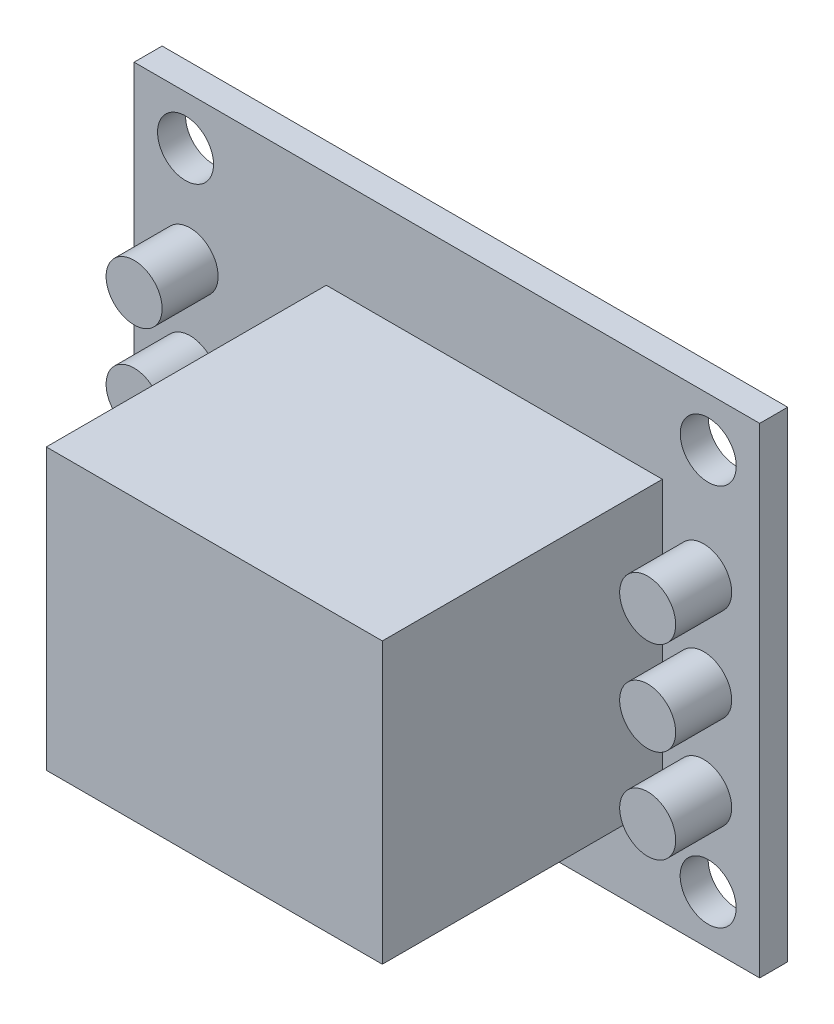
ISO-10303-21;
HEADER;
FILE_DESCRIPTION(('STEP AP214'),'2;1');
FILE_NAME('part.step','',(''),(''),'','','');
FILE_SCHEMA(('AUTOMOTIVE_DESIGN { 1 0 10303 214 1 1 1 1 }'));
ENDSEC;
DATA;
#1=APPLICATION_CONTEXT('core data for automotive mechanical design processes');
#2=APPLICATION_PROTOCOL_DEFINITION('international standard','automotive_design',2000,#1);
#3=PRODUCT_CONTEXT('',#1,'mechanical');
#4=PRODUCT('Part','Part','',(#3));
#5=PRODUCT_RELATED_PRODUCT_CATEGORY('part','',(#4));
#6=PRODUCT_DEFINITION_FORMATION('','',#4);
#7=PRODUCT_DEFINITION_CONTEXT('part definition',#1,'design');
#8=PRODUCT_DEFINITION('design','',#6,#7);
#9=PRODUCT_DEFINITION_SHAPE('','',#8);
#10=(LENGTH_UNIT() NAMED_UNIT(*) SI_UNIT(.MILLI.,.METRE.));
#11=(NAMED_UNIT(*) PLANE_ANGLE_UNIT() SI_UNIT($,.RADIAN.));
#12=(NAMED_UNIT(*) SI_UNIT($,.STERADIAN.) SOLID_ANGLE_UNIT());
#13=UNCERTAINTY_MEASURE_WITH_UNIT(LENGTH_MEASURE(1.E-05),#10,'distance_accuracy_value','');
#14=(GEOMETRIC_REPRESENTATION_CONTEXT(3) GLOBAL_UNCERTAINTY_ASSIGNED_CONTEXT((#13)) GLOBAL_UNIT_ASSIGNED_CONTEXT((#10,
#11,#12)) REPRESENTATION_CONTEXT('',''));
#15=CARTESIAN_POINT('',(0.,0.,0.));
#16=DIRECTION('',(0.,0.,1.));
#17=DIRECTION('',(1.,0.,0.));
#18=AXIS2_PLACEMENT_3D('',#15,#16,#17);
#19=CARTESIAN_POINT('',(0.,0.,1.5));
#20=DIRECTION('',(0.,0.,1.));
#21=DIRECTION('',(1.,0.,0.));
#22=AXIS2_PLACEMENT_3D('',#19,#20,#21);
#23=PLANE('',#22);
#24=CARTESIAN_POINT('',(16.28013764939,-5.89932861440915,1.5));
#25=DIRECTION('',(0.,0.,1.));
#26=DIRECTION('',(1.,0.,0.));
#27=AXIS2_PLACEMENT_3D('',#24,#25,#26);
#28=CIRCLE('',#27,1.5);
#29=CARTESIAN_POINT('',(17.78013764939,-5.89932861440915,1.5));
#30=VERTEX_POINT('',#29);
#31=EDGE_CURVE('E291',#30,#30,#28,.T.);
#32=ORIENTED_EDGE('',*,*,#31,.F.);
#33=EDGE_LOOP('',(#32));
#34=FACE_BOUND('',#33,.T.);
#35=CARTESIAN_POINT('',(16.28013764939,-0.899328614409152,1.5));
#36=DIRECTION('',(0.,0.,1.));
#37=DIRECTION('',(1.,0.,0.));
#38=AXIS2_PLACEMENT_3D('',#35,#36,#37);
#39=CIRCLE('',#38,1.5);
#40=CARTESIAN_POINT('',(17.78013764939,-0.899328614409152,1.5));
#41=VERTEX_POINT('',#40);
#42=EDGE_CURVE('E290',#41,#41,#39,.T.);
#43=ORIENTED_EDGE('',*,*,#42,.F.);
#44=EDGE_LOOP('',(#43));
#45=FACE_BOUND('',#44,.T.);
#46=CARTESIAN_POINT('',(16.28013764939,4.10067138559085,1.5));
#47=DIRECTION('',(0.,0.,1.));
#48=DIRECTION('',(1.,0.,0.));
#49=AXIS2_PLACEMENT_3D('',#46,#47,#48);
#50=CIRCLE('',#49,1.5);
#51=CARTESIAN_POINT('',(17.78013764939,4.10067138559085,1.5));
#52=VERTEX_POINT('',#51);
#53=EDGE_CURVE('E300',#52,#52,#50,.T.);
#54=ORIENTED_EDGE('',*,*,#53,.F.);
#55=EDGE_LOOP('',(#54));
#56=FACE_BOUND('',#55,.T.);
#57=CARTESIAN_POINT('',(-11.22986235061,-5.,1.5));
#58=DIRECTION('',(0.,0.,1.));
#59=DIRECTION('',(1.,0.,0.));
#60=AXIS2_PLACEMENT_3D('',#57,#58,#59);
#61=CIRCLE('',#60,1.5);
#62=CARTESIAN_POINT('',(-9.72986235061004,-5.,1.5));
#63=VERTEX_POINT('',#62);
#64=EDGE_CURVE('E305',#63,#63,#61,.T.);
#65=ORIENTED_EDGE('',*,*,#64,.F.);
#66=EDGE_LOOP('',(#65));
#67=FACE_BOUND('',#66,.T.);
#68=CARTESIAN_POINT('',(-11.22986235061,0.,1.5));
#69=DIRECTION('',(0.,0.,1.));
#70=DIRECTION('',(1.,0.,0.));
#71=AXIS2_PLACEMENT_3D('',#68,#69,#70);
#72=CIRCLE('',#71,1.5);
#73=CARTESIAN_POINT('',(-9.72986235061004,0.,1.5));
#74=VERTEX_POINT('',#73);
#75=EDGE_CURVE('E311',#74,#74,#72,.T.);
#76=ORIENTED_EDGE('',*,*,#75,.F.);
#77=EDGE_LOOP('',(#76));
#78=FACE_BOUND('',#77,.T.);
#79=CARTESIAN_POINT('',(-11.22986235061,5.,1.5));
#80=DIRECTION('',(0.,0.,1.));
#81=DIRECTION('',(1.,0.,0.));
#82=AXIS2_PLACEMENT_3D('',#79,#80,#81);
#83=CIRCLE('',#82,1.5);
#84=CARTESIAN_POINT('',(-9.72986235061004,5.,1.5));
#85=VERTEX_POINT('',#84);
#86=EDGE_CURVE('E317',#85,#85,#83,.T.);
#87=ORIENTED_EDGE('',*,*,#86,.F.);
#88=EDGE_LOOP('',(#87));
#89=FACE_BOUND('',#88,.T.);
#90=CARTESIAN_POINT('',(16.52013764939,-10.4262328767123,1.5));
#91=DIRECTION('',(0.,0.,1.));
#92=DIRECTION('',(1.,0.,0.));
#93=AXIS2_PLACEMENT_3D('',#90,#91,#92);
#94=CIRCLE('',#93,1.5);
#95=CARTESIAN_POINT('',(18.02013764939,-10.4262328767123,1.5));
#96=VERTEX_POINT('',#95);
#97=EDGE_CURVE('E144',#96,#96,#94,.T.);
#98=ORIENTED_EDGE('',*,*,#97,.F.);
#99=EDGE_LOOP('',(#98));
#100=FACE_BOUND('',#99,.T.);
#101=CARTESIAN_POINT('',(-11.47486235061,10.0737665135316,1.5));
#102=DIRECTION('',(0.,0.,1.));
#103=DIRECTION('',(1.,0.,0.));
#104=AXIS2_PLACEMENT_3D('',#101,#102,#103);
#105=CIRCLE('',#104,1.5);
#106=CARTESIAN_POINT('',(-9.97486235061004,10.0737665135316,1.5));
#107=VERTEX_POINT('',#106);
#108=EDGE_CURVE('E156',#107,#107,#105,.T.);
#109=ORIENTED_EDGE('',*,*,#108,.F.);
#110=EDGE_LOOP('',(#109));
#111=FACE_BOUND('',#110,.T.);
#112=DIRECTION('',(0.,-1.,0.));
#113=VECTOR('',#112,1.);
#114=CARTESIAN_POINT('',(-14.22986235061,12.6887671232877,1.5));
#115=LINE('',#114,#113);
#116=CARTESIAN_POINT('',(-14.22986235061,12.6887671232877,1.5));
#117=VERTEX_POINT('',#116);
#118=CARTESIAN_POINT('',(-14.22986235061,-13.0412328767123,1.5));
#119=VERTEX_POINT('',#118);
#120=EDGE_CURVE('E162',#117,#119,#115,.T.);
#121=ORIENTED_EDGE('',*,*,#120,.T.);
#122=DIRECTION('',(1.,0.,0.));
#123=VECTOR('',#122,1.);
#124=CARTESIAN_POINT('',(-14.22986235061,-13.0412328767123,1.5));
#125=LINE('',#124,#123);
#126=CARTESIAN_POINT('',(19.28013764939,-13.0412328767123,1.5));
#127=VERTEX_POINT('',#126);
#128=EDGE_CURVE('E86',#119,#127,#125,.T.);
#129=ORIENTED_EDGE('',*,*,#128,.T.);
#130=DIRECTION('',(0.,1.,0.));
#131=VECTOR('',#130,1.);
#132=CARTESIAN_POINT('',(19.28013764939,12.6887671232877,1.5));
#133=LINE('',#132,#131);
#134=CARTESIAN_POINT('',(19.28013764939,12.6887671232877,1.5));
#135=VERTEX_POINT('',#134);
#136=EDGE_CURVE('E165',#127,#135,#133,.T.);
#137=ORIENTED_EDGE('',*,*,#136,.T.);
#138=DIRECTION('',(-1.,0.,0.));
#139=VECTOR('',#138,1.);
#140=CARTESIAN_POINT('',(-14.22986235061,12.6887671232877,1.5));
#141=LINE('',#140,#139);
#142=EDGE_CURVE('E58',#135,#117,#141,.T.);
#143=ORIENTED_EDGE('',*,*,#142,.T.);
#144=EDGE_LOOP('',(#121,#129,#137,#143));
#145=FACE_BOUND('',#144,.T.);
#146=CARTESIAN_POINT('',(-11.47986235061,-10.4262328767123,1.5));
#147=DIRECTION('',(0.,0.,1.));
#148=DIRECTION('',(1.,0.,0.));
#149=AXIS2_PLACEMENT_3D('',#146,#147,#148);
#150=CIRCLE('',#149,1.5);
#151=CARTESIAN_POINT('',(-9.97986235061004,-10.4262328767123,1.5));
#152=VERTEX_POINT('',#151);
#153=EDGE_CURVE('E150',#152,#152,#150,.T.);
#154=ORIENTED_EDGE('',*,*,#153,.F.);
#155=EDGE_LOOP('',(#154));
#156=FACE_BOUND('',#155,.T.);
#157=CARTESIAN_POINT('',(16.52513764939,10.0737665135316,1.5));
#158=DIRECTION('',(0.,0.,1.));
#159=DIRECTION('',(1.,0.,0.));
#160=AXIS2_PLACEMENT_3D('',#157,#158,#159);
#161=CIRCLE('',#160,1.5);
#162=CARTESIAN_POINT('',(18.02513764939,10.0737665135316,1.5));
#163=VERTEX_POINT('',#162);
#164=EDGE_CURVE('E136',#163,#163,#161,.T.);
#165=ORIENTED_EDGE('',*,*,#164,.F.);
#166=EDGE_LOOP('',(#165));
#167=FACE_BOUND('',#166,.T.);
#168=DIRECTION('',(1.,0.,0.));
#169=VECTOR('',#168,1.);
#170=CARTESIAN_POINT('',(-3.93328594625488,-7.51123287671233,1.5));
#171=LINE('',#170,#169);
#172=CARTESIAN_POINT('',(-3.93328594625488,-7.51123287671233,1.5));
#173=VERTEX_POINT('',#172);
#174=CARTESIAN_POINT('',(14.0667140537451,-7.51123287671233,1.5));
#175=VERTEX_POINT('',#174);
#176=EDGE_CURVE('E329',#173,#175,#171,.T.);
#177=ORIENTED_EDGE('',*,*,#176,.F.);
#178=DIRECTION('',(0.,-1.,0.));
#179=VECTOR('',#178,1.);
#180=CARTESIAN_POINT('',(-3.93328594625489,7.48876712328767,1.5));
#181=LINE('',#180,#179);
#182=CARTESIAN_POINT('',(-3.93328594625489,7.48876712328767,1.5));
#183=VERTEX_POINT('',#182);
#184=EDGE_CURVE('E131',#183,#173,#181,.T.);
#185=ORIENTED_EDGE('',*,*,#184,.F.);
#186=DIRECTION('',(-1.,0.,0.));
#187=VECTOR('',#186,1.);
#188=CARTESIAN_POINT('',(-3.93328594625489,7.48876712328767,1.5));
#189=LINE('',#188,#187);
#190=CARTESIAN_POINT('',(14.0667140537451,7.48876712328767,1.5));
#191=VERTEX_POINT('',#190);
#192=EDGE_CURVE('E127',#191,#183,#189,.T.);
#193=ORIENTED_EDGE('',*,*,#192,.F.);
#194=DIRECTION('',(0.,1.,0.));
#195=VECTOR('',#194,1.);
#196=CARTESIAN_POINT('',(14.0667140537451,7.48876712328767,1.5));
#197=LINE('',#196,#195);
#198=EDGE_CURVE('E331',#175,#191,#197,.T.);
#199=ORIENTED_EDGE('',*,*,#198,.F.);
#200=EDGE_LOOP('',(#177,#185,#193,#199));
#201=FACE_BOUND('',#200,.T.);
#202=ADVANCED_FACE('F34',(#34,#45,#56,#67,#78,#89,#100,#111,#145,#156,#167,#201),#23,.T.);
#203=CARTESIAN_POINT('',(0.,0.,0.));
#204=DIRECTION('',(0.,0.,1.));
#205=DIRECTION('',(1.,0.,0.));
#206=AXIS2_PLACEMENT_3D('',#203,#204,#205);
#207=PLANE('',#206);
#208=DIRECTION('',(0.,-1.,0.));
#209=VECTOR('',#208,1.);
#210=CARTESIAN_POINT('',(-14.22986235061,12.6887671232877,0.));
#211=LINE('',#210,#209);
#212=CARTESIAN_POINT('',(-14.22986235061,12.6887671232877,0.));
#213=VERTEX_POINT('',#212);
#214=CARTESIAN_POINT('',(-14.22986235061,-13.0412328767123,0.));
#215=VERTEX_POINT('',#214);
#216=EDGE_CURVE('E159',#213,#215,#211,.T.);
#217=ORIENTED_EDGE('',*,*,#216,.F.);
#218=DIRECTION('',(-1.,0.,0.));
#219=VECTOR('',#218,1.);
#220=CARTESIAN_POINT('',(-14.22986235061,12.6887671232877,0.));
#221=LINE('',#220,#219);
#222=CARTESIAN_POINT('',(19.28013764939,12.6887671232877,0.));
#223=VERTEX_POINT('',#222);
#224=EDGE_CURVE('E79',#223,#213,#221,.T.);
#225=ORIENTED_EDGE('',*,*,#224,.F.);
#226=DIRECTION('',(0.,1.,0.));
#227=VECTOR('',#226,1.);
#228=CARTESIAN_POINT('',(19.28013764939,12.6887671232877,0.));
#229=LINE('',#228,#227);
#230=CARTESIAN_POINT('',(19.28013764939,-13.0412328767123,0.));
#231=VERTEX_POINT('',#230);
#232=EDGE_CURVE('E173',#231,#223,#229,.T.);
#233=ORIENTED_EDGE('',*,*,#232,.F.);
#234=DIRECTION('',(1.,0.,0.));
#235=VECTOR('',#234,1.);
#236=CARTESIAN_POINT('',(-14.22986235061,-13.0412328767123,0.));
#237=LINE('',#236,#235);
#238=EDGE_CURVE('E171',#215,#231,#237,.T.);
#239=ORIENTED_EDGE('',*,*,#238,.F.);
#240=EDGE_LOOP('',(#217,#225,#233,#239));
#241=FACE_BOUND('',#240,.T.);
#242=CARTESIAN_POINT('',(-11.47486235061,10.0737665135316,0.));
#243=DIRECTION('',(0.,0.,1.));
#244=DIRECTION('',(1.,0.,0.));
#245=AXIS2_PLACEMENT_3D('',#242,#243,#244);
#246=CIRCLE('',#245,1.5);
#247=CARTESIAN_POINT('',(-9.97486235061004,10.0737665135316,0.));
#248=VERTEX_POINT('',#247);
#249=EDGE_CURVE('E153',#248,#248,#246,.T.);
#250=ORIENTED_EDGE('',*,*,#249,.T.);
#251=EDGE_LOOP('',(#250));
#252=FACE_BOUND('',#251,.T.);
#253=CARTESIAN_POINT('',(-11.47986235061,-10.4262328767123,0.));
#254=DIRECTION('',(0.,0.,1.));
#255=DIRECTION('',(1.,0.,0.));
#256=AXIS2_PLACEMENT_3D('',#253,#254,#255);
#257=CIRCLE('',#256,1.5);
#258=CARTESIAN_POINT('',(-9.97986235061004,-10.4262328767123,0.));
#259=VERTEX_POINT('',#258);
#260=EDGE_CURVE('E147',#259,#259,#257,.T.);
#261=ORIENTED_EDGE('',*,*,#260,.T.);
#262=EDGE_LOOP('',(#261));
#263=FACE_BOUND('',#262,.T.);
#264=CARTESIAN_POINT('',(16.52013764939,-10.4262328767123,0.));
#265=DIRECTION('',(0.,0.,1.));
#266=DIRECTION('',(1.,0.,0.));
#267=AXIS2_PLACEMENT_3D('',#264,#265,#266);
#268=CIRCLE('',#267,1.5);
#269=CARTESIAN_POINT('',(18.02013764939,-10.4262328767123,0.));
#270=VERTEX_POINT('',#269);
#271=EDGE_CURVE('E142',#270,#270,#268,.T.);
#272=ORIENTED_EDGE('',*,*,#271,.T.);
#273=EDGE_LOOP('',(#272));
#274=FACE_BOUND('',#273,.T.);
#275=CARTESIAN_POINT('',(16.52513764939,10.0737665135316,0.));
#276=DIRECTION('',(0.,0.,1.));
#277=DIRECTION('',(1.,0.,0.));
#278=AXIS2_PLACEMENT_3D('',#275,#276,#277);
#279=CIRCLE('',#278,1.5);
#280=CARTESIAN_POINT('',(18.02513764939,10.0737665135316,0.));
#281=VERTEX_POINT('',#280);
#282=EDGE_CURVE('E133',#281,#281,#279,.T.);
#283=ORIENTED_EDGE('',*,*,#282,.T.);
#284=EDGE_LOOP('',(#283));
#285=FACE_BOUND('',#284,.T.);
#286=ADVANCED_FACE('F186',(#241,#252,#263,#274,#285),#207,.F.);
#287=CARTESIAN_POINT('',(-14.22986235061,12.6887671232877,1.5));
#288=DIRECTION('',(1.,0.,0.));
#289=DIRECTION('',(0.,1.,0.));
#290=AXIS2_PLACEMENT_3D('',#287,#288,#289);
#291=PLANE('',#290);
#292=ORIENTED_EDGE('',*,*,#216,.T.);
#293=DIRECTION('',(0.,0.,-1.));
#294=VECTOR('',#293,1.);
#295=CARTESIAN_POINT('',(-14.22986235061,-13.0412328767123,1.5));
#296=LINE('',#295,#294);
#297=EDGE_CURVE('E11',#119,#215,#296,.T.);
#298=ORIENTED_EDGE('',*,*,#297,.F.);
#299=ORIENTED_EDGE('',*,*,#120,.F.);
#300=DIRECTION('',(0.,0.,-1.));
#301=VECTOR('',#300,1.);
#302=CARTESIAN_POINT('',(-14.22986235061,12.6887671232877,1.5));
#303=LINE('',#302,#301);
#304=EDGE_CURVE('E168',#117,#213,#303,.T.);
#305=ORIENTED_EDGE('',*,*,#304,.T.);
#306=EDGE_LOOP('',(#292,#298,#299,#305));
#307=FACE_BOUND('',#306,.T.);
#308=ADVANCED_FACE('F36',(#307),#291,.F.);
#309=CARTESIAN_POINT('',(-14.22986235061,-13.0412328767123,1.5));
#310=DIRECTION('',(0.,1.,0.));
#311=DIRECTION('',(0.,0.,1.));
#312=AXIS2_PLACEMENT_3D('',#309,#310,#311);
#313=PLANE('',#312);
#314=ORIENTED_EDGE('',*,*,#238,.T.);
#315=DIRECTION('',(0.,0.,-1.));
#316=VECTOR('',#315,1.);
#317=CARTESIAN_POINT('',(19.28013764939,-13.0412328767123,1.5));
#318=LINE('',#317,#316);
#319=EDGE_CURVE('E42',#127,#231,#318,.T.);
#320=ORIENTED_EDGE('',*,*,#319,.F.);
#321=ORIENTED_EDGE('',*,*,#128,.F.);
#322=ORIENTED_EDGE('',*,*,#297,.T.);
#323=EDGE_LOOP('',(#314,#320,#321,#322));
#324=FACE_BOUND('',#323,.T.);
#325=ADVANCED_FACE('F202',(#324),#313,.F.);
#326=CARTESIAN_POINT('',(19.28013764939,12.6887671232877,1.5));
#327=DIRECTION('',(-1.,0.,0.));
#328=DIRECTION('',(0.,-1.,0.));
#329=AXIS2_PLACEMENT_3D('',#326,#327,#328);
#330=PLANE('',#329);
#331=ORIENTED_EDGE('',*,*,#232,.T.);
#332=DIRECTION('',(0.,0.,-1.));
#333=VECTOR('',#332,1.);
#334=CARTESIAN_POINT('',(19.28013764939,12.6887671232877,1.5));
#335=LINE('',#334,#333);
#336=EDGE_CURVE('E177',#135,#223,#335,.T.);
#337=ORIENTED_EDGE('',*,*,#336,.F.);
#338=ORIENTED_EDGE('',*,*,#136,.F.);
#339=ORIENTED_EDGE('',*,*,#319,.T.);
#340=EDGE_LOOP('',(#331,#337,#338,#339));
#341=FACE_BOUND('',#340,.T.);
#342=ADVANCED_FACE('F182',(#341),#330,.F.);
#343=CARTESIAN_POINT('',(-14.22986235061,12.6887671232877,1.5));
#344=DIRECTION('',(0.,-1.,0.));
#345=DIRECTION('',(0.,0.,-1.));
#346=AXIS2_PLACEMENT_3D('',#343,#344,#345);
#347=PLANE('',#346);
#348=ORIENTED_EDGE('',*,*,#224,.T.);
#349=ORIENTED_EDGE('',*,*,#304,.F.);
#350=ORIENTED_EDGE('',*,*,#142,.F.);
#351=ORIENTED_EDGE('',*,*,#336,.T.);
#352=EDGE_LOOP('',(#348,#349,#350,#351));
#353=FACE_BOUND('',#352,.T.);
#354=ADVANCED_FACE('F191',(#353),#347,.F.);
#355=CARTESIAN_POINT('',(-11.47486235061,10.0737665135316,1.5));
#356=DIRECTION('',(0.,0.,-1.));
#357=DIRECTION('',(-1.,0.,0.));
#358=AXIS2_PLACEMENT_3D('',#355,#356,#357);
#359=CYLINDRICAL_SURFACE('',#358,1.5);
#360=ORIENTED_EDGE('',*,*,#108,.T.);
#361=EDGE_LOOP('',(#360));
#362=FACE_BOUND('',#361,.T.);
#363=ORIENTED_EDGE('',*,*,#249,.F.);
#364=EDGE_LOOP('',(#363));
#365=FACE_BOUND('',#364,.T.);
#366=ADVANCED_FACE('F193',(#362,#365),#359,.F.);
#367=CARTESIAN_POINT('',(-11.47986235061,-10.4262328767123,1.5));
#368=DIRECTION('',(0.,0.,-1.));
#369=DIRECTION('',(-1.,0.,0.));
#370=AXIS2_PLACEMENT_3D('',#367,#368,#369);
#371=CYLINDRICAL_SURFACE('',#370,1.5);
#372=ORIENTED_EDGE('',*,*,#153,.T.);
#373=EDGE_LOOP('',(#372));
#374=FACE_BOUND('',#373,.T.);
#375=ORIENTED_EDGE('',*,*,#260,.F.);
#376=EDGE_LOOP('',(#375));
#377=FACE_BOUND('',#376,.T.);
#378=ADVANCED_FACE('F199',(#374,#377),#371,.F.);
#379=CARTESIAN_POINT('',(16.52013764939,-10.4262328767123,1.5));
#380=DIRECTION('',(0.,0.,-1.));
#381=DIRECTION('',(-1.,0.,0.));
#382=AXIS2_PLACEMENT_3D('',#379,#380,#381);
#383=CYLINDRICAL_SURFACE('',#382,1.5);
#384=ORIENTED_EDGE('',*,*,#97,.T.);
#385=EDGE_LOOP('',(#384));
#386=FACE_BOUND('',#385,.T.);
#387=ORIENTED_EDGE('',*,*,#271,.F.);
#388=EDGE_LOOP('',(#387));
#389=FACE_BOUND('',#388,.T.);
#390=ADVANCED_FACE('F216',(#386,#389),#383,.F.);
#391=CARTESIAN_POINT('',(16.52513764939,10.0737665135316,1.5));
#392=DIRECTION('',(0.,0.,-1.));
#393=DIRECTION('',(-1.,0.,0.));
#394=AXIS2_PLACEMENT_3D('',#391,#392,#393);
#395=CYLINDRICAL_SURFACE('',#394,1.5);
#396=ORIENTED_EDGE('',*,*,#164,.T.);
#397=EDGE_LOOP('',(#396));
#398=FACE_BOUND('',#397,.T.);
#399=ORIENTED_EDGE('',*,*,#282,.F.);
#400=EDGE_LOOP('',(#399));
#401=FACE_BOUND('',#400,.T.);
#402=ADVANCED_FACE('F220',(#398,#401),#395,.F.);
#403=CARTESIAN_POINT('',(-3.93328594625489,7.48876712328767,16.5));
#404=DIRECTION('',(1.,0.,0.));
#405=DIRECTION('',(0.,1.,0.));
#406=AXIS2_PLACEMENT_3D('',#403,#404,#405);
#407=PLANE('',#406);
#408=ORIENTED_EDGE('',*,*,#184,.T.);
#409=DIRECTION('',(0.,0.,-1.));
#410=VECTOR('',#409,1.);
#411=CARTESIAN_POINT('',(-3.93328594625488,-7.51123287671233,16.5));
#412=LINE('',#411,#410);
#413=CARTESIAN_POINT('',(-3.93328594625488,-7.51123287671233,16.5));
#414=VERTEX_POINT('',#413);
#415=EDGE_CURVE('E112',#414,#173,#412,.T.);
#416=ORIENTED_EDGE('',*,*,#415,.F.);
#417=DIRECTION('',(0.,-1.,0.));
#418=VECTOR('',#417,1.);
#419=CARTESIAN_POINT('',(-3.93328594625489,7.48876712328767,16.5));
#420=LINE('',#419,#418);
#421=CARTESIAN_POINT('',(-3.93328594625489,7.48876712328767,16.5));
#422=VERTEX_POINT('',#421);
#423=EDGE_CURVE('E119',#422,#414,#420,.T.);
#424=ORIENTED_EDGE('',*,*,#423,.F.);
#425=DIRECTION('',(0.,0.,-1.));
#426=VECTOR('',#425,1.);
#427=CARTESIAN_POINT('',(-3.93328594625489,7.48876712328767,16.5));
#428=LINE('',#427,#426);
#429=EDGE_CURVE('E327',#422,#183,#428,.T.);
#430=ORIENTED_EDGE('',*,*,#429,.T.);
#431=EDGE_LOOP('',(#408,#416,#424,#430));
#432=FACE_BOUND('',#431,.T.);
#433=ADVANCED_FACE('F129',(#432),#407,.F.);
#434=CARTESIAN_POINT('',(-3.93328594625488,-7.51123287671233,16.5));
#435=DIRECTION('',(0.,1.,0.));
#436=DIRECTION('',(0.,0.,1.));
#437=AXIS2_PLACEMENT_3D('',#434,#435,#436);
#438=PLANE('',#437);
#439=ORIENTED_EDGE('',*,*,#176,.T.);
#440=DIRECTION('',(0.,0.,-1.));
#441=VECTOR('',#440,1.);
#442=CARTESIAN_POINT('',(14.0667140537451,-7.51123287671233,16.5));
#443=LINE('',#442,#441);
#444=CARTESIAN_POINT('',(14.0667140537451,-7.51123287671233,16.5));
#445=VERTEX_POINT('',#444);
#446=EDGE_CURVE('E115',#445,#175,#443,.T.);
#447=ORIENTED_EDGE('',*,*,#446,.F.);
#448=DIRECTION('',(1.,0.,0.));
#449=VECTOR('',#448,1.);
#450=CARTESIAN_POINT('',(-3.93328594625488,-7.51123287671233,16.5));
#451=LINE('',#450,#449);
#452=EDGE_CURVE('E108',#414,#445,#451,.T.);
#453=ORIENTED_EDGE('',*,*,#452,.F.);
#454=ORIENTED_EDGE('',*,*,#415,.T.);
#455=EDGE_LOOP('',(#439,#447,#453,#454));
#456=FACE_BOUND('',#455,.T.);
#457=ADVANCED_FACE('F110',(#456),#438,.F.);
#458=CARTESIAN_POINT('',(14.0667140537451,7.48876712328767,16.5));
#459=DIRECTION('',(-1.,0.,0.));
#460=DIRECTION('',(0.,-1.,0.));
#461=AXIS2_PLACEMENT_3D('',#458,#459,#460);
#462=PLANE('',#461);
#463=ORIENTED_EDGE('',*,*,#198,.T.);
#464=DIRECTION('',(0.,0.,-1.));
#465=VECTOR('',#464,1.);
#466=CARTESIAN_POINT('',(14.0667140537451,7.48876712328767,16.5));
#467=LINE('',#466,#465);
#468=CARTESIAN_POINT('',(14.0667140537451,7.48876712328767,16.5));
#469=VERTEX_POINT('',#468);
#470=EDGE_CURVE('E49',#469,#191,#467,.T.);
#471=ORIENTED_EDGE('',*,*,#470,.F.);
#472=DIRECTION('',(0.,1.,0.));
#473=VECTOR('',#472,1.);
#474=CARTESIAN_POINT('',(14.0667140537451,7.48876712328767,16.5));
#475=LINE('',#474,#473);
#476=EDGE_CURVE('E118',#445,#469,#475,.T.);
#477=ORIENTED_EDGE('',*,*,#476,.F.);
#478=ORIENTED_EDGE('',*,*,#446,.T.);
#479=EDGE_LOOP('',(#463,#471,#477,#478));
#480=FACE_BOUND('',#479,.T.);
#481=ADVANCED_FACE('F229',(#480),#462,.F.);
#482=CARTESIAN_POINT('',(-3.93328594625489,7.48876712328767,16.5));
#483=DIRECTION('',(0.,-1.,0.));
#484=DIRECTION('',(0.,0.,-1.));
#485=AXIS2_PLACEMENT_3D('',#482,#483,#484);
#486=PLANE('',#485);
#487=ORIENTED_EDGE('',*,*,#192,.T.);
#488=ORIENTED_EDGE('',*,*,#429,.F.);
#489=DIRECTION('',(-1.,0.,0.));
#490=VECTOR('',#489,1.);
#491=CARTESIAN_POINT('',(-3.93328594625489,7.48876712328767,16.5));
#492=LINE('',#491,#490);
#493=EDGE_CURVE('E123',#469,#422,#492,.T.);
#494=ORIENTED_EDGE('',*,*,#493,.F.);
#495=ORIENTED_EDGE('',*,*,#470,.T.);
#496=EDGE_LOOP('',(#487,#488,#494,#495));
#497=FACE_BOUND('',#496,.T.);
#498=ADVANCED_FACE('F232',(#497),#486,.F.);
#499=CARTESIAN_POINT('',(0.,0.,16.5));
#500=DIRECTION('',(0.,0.,1.));
#501=DIRECTION('',(1.,0.,0.));
#502=AXIS2_PLACEMENT_3D('',#499,#500,#501);
#503=PLANE('',#502);
#504=ORIENTED_EDGE('',*,*,#423,.T.);
#505=ORIENTED_EDGE('',*,*,#452,.T.);
#506=ORIENTED_EDGE('',*,*,#476,.T.);
#507=ORIENTED_EDGE('',*,*,#493,.T.);
#508=EDGE_LOOP('',(#504,#505,#506,#507));
#509=FACE_BOUND('',#508,.T.);
#510=ADVANCED_FACE('F122',(#509),#503,.T.);
#511=CARTESIAN_POINT('',(-11.22986235061,5.,4.5));
#512=DIRECTION('',(0.,0.,-1.));
#513=DIRECTION('',(-1.,0.,0.));
#514=AXIS2_PLACEMENT_3D('',#511,#512,#513);
#515=CYLINDRICAL_SURFACE('',#514,1.5);
#516=CARTESIAN_POINT('',(-11.22986235061,5.,4.5));
#517=DIRECTION('',(0.,0.,1.));
#518=DIRECTION('',(1.,0.,0.));
#519=AXIS2_PLACEMENT_3D('',#516,#517,#518);
#520=CIRCLE('',#519,1.5);
#521=CARTESIAN_POINT('',(-9.72986235061004,5.,4.5));
#522=VERTEX_POINT('',#521);
#523=EDGE_CURVE('E320',#522,#522,#520,.T.);
#524=ORIENTED_EDGE('',*,*,#523,.F.);
#525=EDGE_LOOP('',(#524));
#526=FACE_BOUND('',#525,.T.);
#527=ORIENTED_EDGE('',*,*,#86,.T.);
#528=EDGE_LOOP('',(#527));
#529=FACE_BOUND('',#528,.T.);
#530=ADVANCED_FACE('F238',(#526,#529),#515,.T.);
#531=CARTESIAN_POINT('',(-11.22986235061,5.,4.5));
#532=DIRECTION('',(0.,0.,1.));
#533=DIRECTION('',(1.,0.,0.));
#534=AXIS2_PLACEMENT_3D('',#531,#532,#533);
#535=PLANE('',#534);
#536=ORIENTED_EDGE('',*,*,#523,.T.);
#537=EDGE_LOOP('',(#536));
#538=FACE_BOUND('',#537,.T.);
#539=ADVANCED_FACE('F241',(#538),#535,.T.);
#540=CARTESIAN_POINT('',(-11.22986235061,0.,4.5));
#541=DIRECTION('',(0.,0.,-1.));
#542=DIRECTION('',(-1.,0.,0.));
#543=AXIS2_PLACEMENT_3D('',#540,#541,#542);
#544=CYLINDRICAL_SURFACE('',#543,1.5);
#545=CARTESIAN_POINT('',(-11.22986235061,0.,4.5));
#546=DIRECTION('',(0.,0.,1.));
#547=DIRECTION('',(1.,0.,0.));
#548=AXIS2_PLACEMENT_3D('',#545,#546,#547);
#549=CIRCLE('',#548,1.5);
#550=CARTESIAN_POINT('',(-9.72986235061004,0.,4.5));
#551=VERTEX_POINT('',#550);
#552=EDGE_CURVE('E314',#551,#551,#549,.T.);
#553=ORIENTED_EDGE('',*,*,#552,.F.);
#554=EDGE_LOOP('',(#553));
#555=FACE_BOUND('',#554,.T.);
#556=ORIENTED_EDGE('',*,*,#75,.T.);
#557=EDGE_LOOP('',(#556));
#558=FACE_BOUND('',#557,.T.);
#559=ADVANCED_FACE('F245',(#555,#558),#544,.T.);
#560=CARTESIAN_POINT('',(-11.22986235061,0.,4.5));
#561=DIRECTION('',(0.,0.,1.));
#562=DIRECTION('',(1.,0.,0.));
#563=AXIS2_PLACEMENT_3D('',#560,#561,#562);
#564=PLANE('',#563);
#565=ORIENTED_EDGE('',*,*,#552,.T.);
#566=EDGE_LOOP('',(#565));
#567=FACE_BOUND('',#566,.T.);
#568=ADVANCED_FACE('F249',(#567),#564,.T.);
#569=CARTESIAN_POINT('',(-11.22986235061,-5.,4.5));
#570=DIRECTION('',(0.,0.,-1.));
#571=DIRECTION('',(-1.,0.,0.));
#572=AXIS2_PLACEMENT_3D('',#569,#570,#571);
#573=CYLINDRICAL_SURFACE('',#572,1.5);
#574=CARTESIAN_POINT('',(-11.22986235061,-5.,4.5));
#575=DIRECTION('',(0.,0.,1.));
#576=DIRECTION('',(1.,0.,0.));
#577=AXIS2_PLACEMENT_3D('',#574,#575,#576);
#578=CIRCLE('',#577,1.5);
#579=CARTESIAN_POINT('',(-9.72986235061004,-5.,4.5));
#580=VERTEX_POINT('',#579);
#581=EDGE_CURVE('E308',#580,#580,#578,.T.);
#582=ORIENTED_EDGE('',*,*,#581,.F.);
#583=EDGE_LOOP('',(#582));
#584=FACE_BOUND('',#583,.T.);
#585=ORIENTED_EDGE('',*,*,#64,.T.);
#586=EDGE_LOOP('',(#585));
#587=FACE_BOUND('',#586,.T.);
#588=ADVANCED_FACE('F253',(#584,#587),#573,.T.);
#589=CARTESIAN_POINT('',(-11.22986235061,-5.,4.5));
#590=DIRECTION('',(0.,0.,1.));
#591=DIRECTION('',(1.,0.,0.));
#592=AXIS2_PLACEMENT_3D('',#589,#590,#591);
#593=PLANE('',#592);
#594=ORIENTED_EDGE('',*,*,#581,.T.);
#595=EDGE_LOOP('',(#594));
#596=FACE_BOUND('',#595,.T.);
#597=ADVANCED_FACE('F257',(#596),#593,.T.);
#598=CARTESIAN_POINT('',(16.28013764939,4.10067138559085,4.5));
#599=DIRECTION('',(0.,0.,-1.));
#600=DIRECTION('',(-1.,0.,0.));
#601=AXIS2_PLACEMENT_3D('',#598,#599,#600);
#602=CYLINDRICAL_SURFACE('',#601,1.5);
#603=CARTESIAN_POINT('',(16.28013764939,4.10067138559085,4.5));
#604=DIRECTION('',(0.,0.,1.));
#605=DIRECTION('',(1.,0.,0.));
#606=AXIS2_PLACEMENT_3D('',#603,#604,#605);
#607=CIRCLE('',#606,1.5);
#608=CARTESIAN_POINT('',(17.78013764939,4.10067138559085,4.5));
#609=VERTEX_POINT('',#608);
#610=EDGE_CURVE('E302',#609,#609,#607,.T.);
#611=ORIENTED_EDGE('',*,*,#610,.F.);
#612=EDGE_LOOP('',(#611));
#613=FACE_BOUND('',#612,.T.);
#614=ORIENTED_EDGE('',*,*,#53,.T.);
#615=EDGE_LOOP('',(#614));
#616=FACE_BOUND('',#615,.T.);
#617=ADVANCED_FACE('F261',(#613,#616),#602,.T.);
#618=CARTESIAN_POINT('',(16.28013764939,4.10067138559085,4.5));
#619=DIRECTION('',(0.,0.,1.));
#620=DIRECTION('',(1.,0.,0.));
#621=AXIS2_PLACEMENT_3D('',#618,#619,#620);
#622=PLANE('',#621);
#623=ORIENTED_EDGE('',*,*,#610,.T.);
#624=EDGE_LOOP('',(#623));
#625=FACE_BOUND('',#624,.T.);
#626=ADVANCED_FACE('F265',(#625),#622,.T.);
#627=CARTESIAN_POINT('',(16.28013764939,-0.899328614409152,4.5));
#628=DIRECTION('',(0.,0.,-1.));
#629=DIRECTION('',(-1.,0.,0.));
#630=AXIS2_PLACEMENT_3D('',#627,#628,#629);
#631=CYLINDRICAL_SURFACE('',#630,1.5);
#632=CARTESIAN_POINT('',(16.28013764939,-0.899328614409152,4.5));
#633=DIRECTION('',(0.,0.,1.));
#634=DIRECTION('',(1.,0.,0.));
#635=AXIS2_PLACEMENT_3D('',#632,#633,#634);
#636=CIRCLE('',#635,1.5);
#637=CARTESIAN_POINT('',(17.78013764939,-0.899328614409152,4.5));
#638=VERTEX_POINT('',#637);
#639=EDGE_CURVE('E294',#638,#638,#636,.T.);
#640=ORIENTED_EDGE('',*,*,#639,.F.);
#641=EDGE_LOOP('',(#640));
#642=FACE_BOUND('',#641,.T.);
#643=ORIENTED_EDGE('',*,*,#42,.T.);
#644=EDGE_LOOP('',(#643));
#645=FACE_BOUND('',#644,.T.);
#646=ADVANCED_FACE('F269',(#642,#645),#631,.T.);
#647=CARTESIAN_POINT('',(16.28013764939,-0.899328614409152,4.5));
#648=DIRECTION('',(0.,0.,1.));
#649=DIRECTION('',(1.,0.,0.));
#650=AXIS2_PLACEMENT_3D('',#647,#648,#649);
#651=PLANE('',#650);
#652=ORIENTED_EDGE('',*,*,#639,.T.);
#653=EDGE_LOOP('',(#652));
#654=FACE_BOUND('',#653,.T.);
#655=ADVANCED_FACE('F273',(#654),#651,.T.);
#656=CARTESIAN_POINT('',(16.28013764939,-5.89932861440915,4.5));
#657=DIRECTION('',(0.,0.,-1.));
#658=DIRECTION('',(-1.,0.,0.));
#659=AXIS2_PLACEMENT_3D('',#656,#657,#658);
#660=CYLINDRICAL_SURFACE('',#659,1.5);
#661=CARTESIAN_POINT('',(16.28013764939,-5.89932861440915,4.5));
#662=DIRECTION('',(0.,0.,1.));
#663=DIRECTION('',(1.,0.,0.));
#664=AXIS2_PLACEMENT_3D('',#661,#662,#663);
#665=CIRCLE('',#664,1.5);
#666=CARTESIAN_POINT('',(17.78013764939,-5.89932861440915,4.5));
#667=VERTEX_POINT('',#666);
#668=EDGE_CURVE('E289',#667,#667,#665,.T.);
#669=ORIENTED_EDGE('',*,*,#668,.F.);
#670=EDGE_LOOP('',(#669));
#671=FACE_BOUND('',#670,.T.);
#672=ORIENTED_EDGE('',*,*,#31,.T.);
#673=EDGE_LOOP('',(#672));
#674=FACE_BOUND('',#673,.T.);
#675=ADVANCED_FACE('F277',(#671,#674),#660,.T.);
#676=CARTESIAN_POINT('',(16.28013764939,-5.89932861440915,4.5));
#677=DIRECTION('',(0.,0.,1.));
#678=DIRECTION('',(1.,0.,0.));
#679=AXIS2_PLACEMENT_3D('',#676,#677,#678);
#680=PLANE('',#679);
#681=ORIENTED_EDGE('',*,*,#668,.T.);
#682=EDGE_LOOP('',(#681));
#683=FACE_BOUND('',#682,.T.);
#684=ADVANCED_FACE('F281',(#683),#680,.T.);
#685=CLOSED_SHELL('',(#202,#286,#308,#325,#342,#354,#366,#378,#390,#402,#433,#457,#481,#498,
#510,#530,#539,#559,#568,#588,#597,#617,#626,#646,#655,#675,#684));
#686=MANIFOLD_SOLID_BREP('B2',#685);
#687=ADVANCED_BREP_SHAPE_REPRESENTATION('',(#18,#686),#14);
#688=SHAPE_DEFINITION_REPRESENTATION(#9,#687);
ENDSEC;
END-ISO-10303-21;
